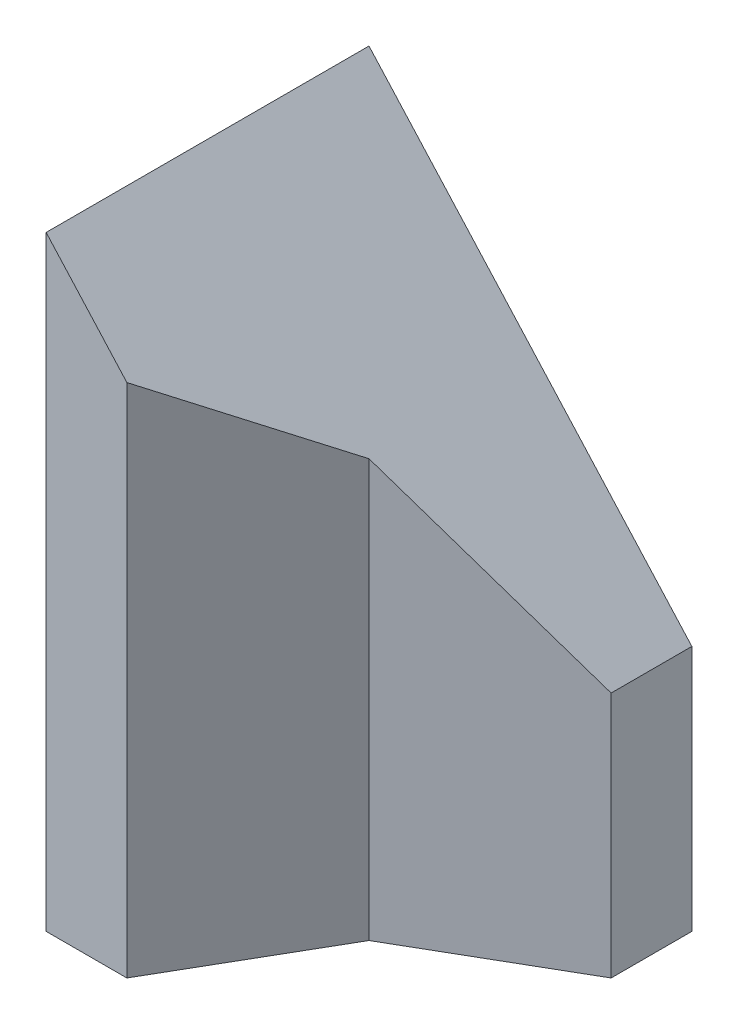
ISO-10303-21;
HEADER;
FILE_DESCRIPTION(('STEP AP214'),'2;1');
FILE_NAME('part.step','',(''),(''),'','','');
FILE_SCHEMA(('AUTOMOTIVE_DESIGN { 1 0 10303 214 1 1 1 1 }'));
ENDSEC;
DATA;
#1=APPLICATION_CONTEXT('core data for automotive mechanical design processes');
#2=APPLICATION_PROTOCOL_DEFINITION('international standard','automotive_design',2000,#1);
#3=PRODUCT_CONTEXT('',#1,'mechanical');
#4=PRODUCT('Part','Part','',(#3));
#5=PRODUCT_RELATED_PRODUCT_CATEGORY('part','',(#4));
#6=PRODUCT_DEFINITION_FORMATION('','',#4);
#7=PRODUCT_DEFINITION_CONTEXT('part definition',#1,'design');
#8=PRODUCT_DEFINITION('design','',#6,#7);
#9=PRODUCT_DEFINITION_SHAPE('','',#8);
#10=(LENGTH_UNIT() NAMED_UNIT(*) SI_UNIT(.MILLI.,.METRE.));
#11=(NAMED_UNIT(*) PLANE_ANGLE_UNIT() SI_UNIT($,.RADIAN.));
#12=(NAMED_UNIT(*) SI_UNIT($,.STERADIAN.) SOLID_ANGLE_UNIT());
#13=UNCERTAINTY_MEASURE_WITH_UNIT(LENGTH_MEASURE(1.E-05),#10,'distance_accuracy_value','');
#14=(GEOMETRIC_REPRESENTATION_CONTEXT(3) GLOBAL_UNCERTAINTY_ASSIGNED_CONTEXT((#13)) GLOBAL_UNIT_ASSIGNED_CONTEXT((#10,
#11,#12)) REPRESENTATION_CONTEXT('',''));
#15=CARTESIAN_POINT('',(0.,0.,0.));
#16=DIRECTION('',(0.,0.,1.));
#17=DIRECTION('',(1.,0.,0.));
#18=AXIS2_PLACEMENT_3D('',#15,#16,#17);
#19=CARTESIAN_POINT('',(50.8,95.25,12.7));
#20=DIRECTION('',(-1.,0.,0.));
#21=DIRECTION('',(0.,0.,1.));
#22=AXIS2_PLACEMENT_3D('',#19,#20,#21);
#23=PLANE('',#22);
#24=DIRECTION('',(0.,0.,-1.));
#25=VECTOR('',#24,1.);
#26=CARTESIAN_POINT('',(50.8,38.8308842466772,149.132085435194));
#27=LINE('',#26,#25);
#28=CARTESIAN_POINT('',(50.8,38.8308842466772,12.7));
#29=VERTEX_POINT('',#28);
#30=CARTESIAN_POINT('',(50.8,38.8308842466772,0.));
#31=VERTEX_POINT('',#30);
#32=EDGE_CURVE('E137',#29,#31,#27,.T.);
#33=ORIENTED_EDGE('',*,*,#32,.F.);
#34=DIRECTION('',(0.,-1.,0.));
#35=VECTOR('',#34,1.);
#36=CARTESIAN_POINT('',(50.8,95.25,12.7));
#37=LINE('',#36,#35);
#38=CARTESIAN_POINT('',(50.8,0.,12.7));
#39=VERTEX_POINT('',#38);
#40=EDGE_CURVE('E105',#29,#39,#37,.T.);
#41=ORIENTED_EDGE('',*,*,#40,.T.);
#42=DIRECTION('',(0.,0.,-1.));
#43=VECTOR('',#42,1.);
#44=CARTESIAN_POINT('',(50.8,0.,12.7));
#45=LINE('',#44,#43);
#46=CARTESIAN_POINT('',(50.8,0.,0.));
#47=VERTEX_POINT('',#46);
#48=EDGE_CURVE('E115',#39,#47,#45,.T.);
#49=ORIENTED_EDGE('',*,*,#48,.T.);
#50=DIRECTION('',(0.,-1.,0.));
#51=VECTOR('',#50,1.);
#52=CARTESIAN_POINT('',(50.8,95.25,0.));
#53=LINE('',#52,#51);
#54=EDGE_CURVE('E11',#31,#47,#53,.T.);
#55=ORIENTED_EDGE('',*,*,#54,.F.);
#56=EDGE_LOOP('',(#33,#41,#49,#55));
#57=FACE_BOUND('',#56,.T.);
#58=ADVANCED_FACE('F33',(#57),#23,.F.);
#59=CARTESIAN_POINT('',(50.8,95.25,0.));
#60=DIRECTION('',(0.,0.,1.));
#61=DIRECTION('',(1.,0.,0.));
#62=AXIS2_PLACEMENT_3D('',#59,#60,#61);
#63=PLANE('',#62);
#64=DIRECTION('',(-0.669130606358859,0.743144825477393,0.));
#65=VECTOR('',#64,1.);
#66=CARTESIAN_POINT('',(22.7449770330017,69.9891438576459,0.));
#67=LINE('',#66,#65);
#68=CARTESIAN_POINT('',(0.,95.25,0.));
#69=VERTEX_POINT('',#68);
#70=EDGE_CURVE('E46',#31,#69,#67,.T.);
#71=ORIENTED_EDGE('',*,*,#70,.F.);
#72=ORIENTED_EDGE('',*,*,#54,.T.);
#73=DIRECTION('',(-1.,0.,0.));
#74=VECTOR('',#73,1.);
#75=CARTESIAN_POINT('',(50.8,0.,0.));
#76=LINE('',#75,#74);
#77=CARTESIAN_POINT('',(0.,0.,0.));
#78=VERTEX_POINT('',#77);
#79=EDGE_CURVE('E118',#47,#78,#76,.T.);
#80=ORIENTED_EDGE('',*,*,#79,.T.);
#81=DIRECTION('',(0.,-1.,0.));
#82=VECTOR('',#81,1.);
#83=CARTESIAN_POINT('',(0.,95.25,0.));
#84=LINE('',#83,#82);
#85=EDGE_CURVE('E40',#69,#78,#84,.T.);
#86=ORIENTED_EDGE('',*,*,#85,.F.);
#87=EDGE_LOOP('',(#71,#72,#80,#86));
#88=FACE_BOUND('',#87,.T.);
#89=ADVANCED_FACE('F153',(#88),#63,.F.);
#90=CARTESIAN_POINT('',(0.,95.25,50.8));
#91=DIRECTION('',(0.,0.,-1.));
#92=DIRECTION('',(-1.,0.,0.));
#93=AXIS2_PLACEMENT_3D('',#90,#91,#92);
#94=PLANE('',#93);
#95=DIRECTION('',(0.669130606358859,-0.743144825477393,0.));
#96=VECTOR('',#95,1.);
#97=CARTESIAN_POINT('',(0.,95.25,50.8));
#98=LINE('',#97,#96);
#99=CARTESIAN_POINT('',(0.,95.25,50.8));
#100=VERTEX_POINT('',#99);
#101=CARTESIAN_POINT('',(12.7,81.1452210616693,50.8));
#102=VERTEX_POINT('',#101);
#103=EDGE_CURVE('E99',#100,#102,#98,.T.);
#104=ORIENTED_EDGE('',*,*,#103,.F.);
#105=DIRECTION('',(0.,-1.,0.));
#106=VECTOR('',#105,1.);
#107=CARTESIAN_POINT('',(0.,95.25,50.8));
#108=LINE('',#107,#106);
#109=CARTESIAN_POINT('',(0.,0.,50.8));
#110=VERTEX_POINT('',#109);
#111=EDGE_CURVE('E85',#100,#110,#108,.T.);
#112=ORIENTED_EDGE('',*,*,#111,.T.);
#113=DIRECTION('',(1.,0.,0.));
#114=VECTOR('',#113,1.);
#115=CARTESIAN_POINT('',(0.,0.,50.8));
#116=LINE('',#115,#114);
#117=CARTESIAN_POINT('',(12.7,0.,50.8));
#118=VERTEX_POINT('',#117);
#119=EDGE_CURVE('E121',#110,#118,#116,.T.);
#120=ORIENTED_EDGE('',*,*,#119,.T.);
#121=DIRECTION('',(0.,-1.,0.));
#122=VECTOR('',#121,1.);
#123=CARTESIAN_POINT('',(12.7,95.25,50.8));
#124=LINE('',#123,#122);
#125=EDGE_CURVE('E96',#102,#118,#124,.T.);
#126=ORIENTED_EDGE('',*,*,#125,.F.);
#127=EDGE_LOOP('',(#104,#112,#120,#126));
#128=FACE_BOUND('',#127,.T.);
#129=ADVANCED_FACE('F100',(#128),#94,.F.);
#130=CARTESIAN_POINT('',(26.6455678841874,95.25,26.6455678841869));
#131=DIRECTION('',(-0.866025403784436,0.,-0.500000000000004));
#132=DIRECTION('',(-0.500000000000004,0.,0.866025403784436));
#133=AXIS2_PLACEMENT_3D('',#130,#131,#132);
#134=PLANE('',#133);
#135=DIRECTION('',(0.437124892854941,-0.485476376548065,-0.757122523677851));
#136=VECTOR('',#135,1.);
#137=CARTESIAN_POINT('',(20.3655456078873,72.6317701765558,37.5228855394029));
#138=LINE('',#137,#136);
#139=CARTESIAN_POINT('',(26.6455678841874,65.6570988430908,26.6455678841869));
#140=VERTEX_POINT('',#139);
#141=EDGE_CURVE('E54',#102,#140,#138,.T.);
#142=ORIENTED_EDGE('',*,*,#141,.F.);
#143=ORIENTED_EDGE('',*,*,#125,.T.);
#144=DIRECTION('',(0.500000000000004,0.,-0.866025403784436));
#145=VECTOR('',#144,1.);
#146=CARTESIAN_POINT('',(26.6455678841874,0.,26.6455678841869));
#147=LINE('',#146,#145);
#148=CARTESIAN_POINT('',(26.6455678841874,0.,26.6455678841869));
#149=VERTEX_POINT('',#148);
#150=EDGE_CURVE('E111',#118,#149,#147,.T.);
#151=ORIENTED_EDGE('',*,*,#150,.T.);
#152=DIRECTION('',(0.,-1.,0.));
#153=VECTOR('',#152,1.);
#154=CARTESIAN_POINT('',(26.6455678841874,95.25,26.6455678841869));
#155=LINE('',#154,#153);
#156=EDGE_CURVE('E108',#140,#149,#155,.T.);
#157=ORIENTED_EDGE('',*,*,#156,.F.);
#158=EDGE_LOOP('',(#142,#143,#151,#157));
#159=FACE_BOUND('',#158,.T.);
#160=ADVANCED_FACE('F132',(#159),#134,.F.);
#161=CARTESIAN_POINT('',(26.6455678841874,95.25,26.6455678841869));
#162=DIRECTION('',(-0.499999999999998,0.,-0.86602540378444));
#163=DIRECTION('',(-0.86602540378444,0.,0.499999999999998));
#164=AXIS2_PLACEMENT_3D('',#161,#162,#163);
#165=PLANE('',#164);
#166=DIRECTION('',(0.624172363244017,-0.693213638029316,-0.360366081939656));
#167=VECTOR('',#166,1.);
#168=CARTESIAN_POINT('',(13.8411695230731,79.8778239078027,34.0381907247874));
#169=LINE('',#168,#167);
#170=EDGE_CURVE('E135',#140,#29,#169,.T.);
#171=ORIENTED_EDGE('',*,*,#170,.F.);
#172=ORIENTED_EDGE('',*,*,#156,.T.);
#173=DIRECTION('',(0.86602540378444,0.,-0.499999999999998));
#174=VECTOR('',#173,1.);
#175=CARTESIAN_POINT('',(26.6455678841874,0.,26.6455678841869));
#176=LINE('',#175,#174);
#177=EDGE_CURVE('E106',#149,#39,#176,.T.);
#178=ORIENTED_EDGE('',*,*,#177,.T.);
#179=ORIENTED_EDGE('',*,*,#40,.F.);
#180=EDGE_LOOP('',(#171,#172,#178,#179));
#181=FACE_BOUND('',#180,.T.);
#182=ADVANCED_FACE('F142',(#181),#165,.F.);
#183=CARTESIAN_POINT('',(0.,95.25,0.));
#184=DIRECTION('',(1.,0.,0.));
#185=DIRECTION('',(0.,0.,-1.));
#186=AXIS2_PLACEMENT_3D('',#183,#184,#185);
#187=PLANE('',#186);
#188=DIRECTION('',(0.,0.,1.));
#189=VECTOR('',#188,1.);
#190=CARTESIAN_POINT('',(0.,0.,0.));
#191=LINE('',#190,#189);
#192=EDGE_CURVE('E92',#78,#110,#191,.T.);
#193=ORIENTED_EDGE('',*,*,#192,.T.);
#194=ORIENTED_EDGE('',*,*,#111,.F.);
#195=DIRECTION('',(0.,0.,1.));
#196=VECTOR('',#195,1.);
#197=CARTESIAN_POINT('',(0.,95.25,0.));
#198=LINE('',#197,#196);
#199=EDGE_CURVE('E90',#69,#100,#198,.T.);
#200=ORIENTED_EDGE('',*,*,#199,.F.);
#201=ORIENTED_EDGE('',*,*,#85,.T.);
#202=EDGE_LOOP('',(#193,#194,#200,#201));
#203=FACE_BOUND('',#202,.T.);
#204=ADVANCED_FACE('F87',(#203),#187,.F.);
#205=CARTESIAN_POINT('',(0.,0.,0.));
#206=DIRECTION('',(0.,1.,0.));
#207=DIRECTION('',(0.,0.,1.));
#208=AXIS2_PLACEMENT_3D('',#205,#206,#207);
#209=PLANE('',#208);
#210=ORIENTED_EDGE('',*,*,#48,.F.);
#211=ORIENTED_EDGE('',*,*,#177,.F.);
#212=ORIENTED_EDGE('',*,*,#150,.F.);
#213=ORIENTED_EDGE('',*,*,#119,.F.);
#214=ORIENTED_EDGE('',*,*,#192,.F.);
#215=ORIENTED_EDGE('',*,*,#79,.F.);
#216=EDGE_LOOP('',(#210,#211,#212,#213,#214,#215));
#217=FACE_BOUND('',#216,.T.);
#218=ADVANCED_FACE('F129',(#217),#209,.F.);
#219=CARTESIAN_POINT('',(0.,95.25,149.132085435194));
#220=DIRECTION('',(0.743144825477393,0.669130606358859,0.));
#221=DIRECTION('',(-0.669130606358859,0.743144825477393,0.));
#222=AXIS2_PLACEMENT_3D('',#219,#220,#221);
#223=PLANE('',#222);
#224=ORIENTED_EDGE('',*,*,#32,.T.);
#225=ORIENTED_EDGE('',*,*,#70,.T.);
#226=ORIENTED_EDGE('',*,*,#199,.T.);
#227=ORIENTED_EDGE('',*,*,#103,.T.);
#228=ORIENTED_EDGE('',*,*,#141,.T.);
#229=ORIENTED_EDGE('',*,*,#170,.T.);
#230=EDGE_LOOP('',(#224,#225,#226,#227,#228,#229));
#231=FACE_BOUND('',#230,.T.);
#232=ADVANCED_FACE('F104',(#231),#223,.T.);
#233=CLOSED_SHELL('',(#58,#89,#129,#160,#182,#204,#218,#232));
#234=MANIFOLD_SOLID_BREP('B2',#233);
#235=ADVANCED_BREP_SHAPE_REPRESENTATION('',(#18,#234),#14);
#236=SHAPE_DEFINITION_REPRESENTATION(#9,#235);
ENDSEC;
END-ISO-10303-21;
